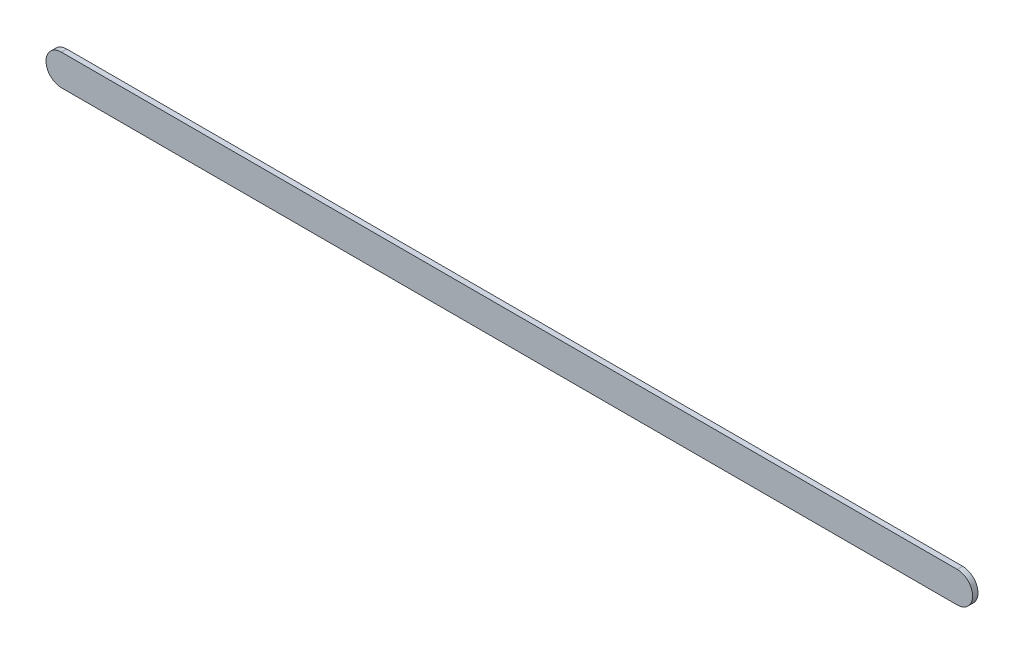
ISO-10303-21;
HEADER;
FILE_DESCRIPTION(('STEP AP214'),'2;1');
FILE_NAME('part.step','',(''),(''),'','','');
FILE_SCHEMA(('AUTOMOTIVE_DESIGN { 1 0 10303 214 1 1 1 1 }'));
ENDSEC;
DATA;
#1=APPLICATION_CONTEXT('core data for automotive mechanical design processes');
#2=APPLICATION_PROTOCOL_DEFINITION('international standard','automotive_design',2000,#1);
#3=PRODUCT_CONTEXT('',#1,'mechanical');
#4=PRODUCT('Part','Part','',(#3));
#5=PRODUCT_RELATED_PRODUCT_CATEGORY('part','',(#4));
#6=PRODUCT_DEFINITION_FORMATION('','',#4);
#7=PRODUCT_DEFINITION_CONTEXT('part definition',#1,'design');
#8=PRODUCT_DEFINITION('design','',#6,#7);
#9=PRODUCT_DEFINITION_SHAPE('','',#8);
#10=(LENGTH_UNIT() NAMED_UNIT(*) SI_UNIT(.MILLI.,.METRE.));
#11=(NAMED_UNIT(*) PLANE_ANGLE_UNIT() SI_UNIT($,.RADIAN.));
#12=(NAMED_UNIT(*) SI_UNIT($,.STERADIAN.) SOLID_ANGLE_UNIT());
#13=UNCERTAINTY_MEASURE_WITH_UNIT(LENGTH_MEASURE(1.E-05),#10,'distance_accuracy_value','');
#14=(GEOMETRIC_REPRESENTATION_CONTEXT(3) GLOBAL_UNCERTAINTY_ASSIGNED_CONTEXT((#13)) GLOBAL_UNIT_ASSIGNED_CONTEXT((#10,
#11,#12)) REPRESENTATION_CONTEXT('',''));
#15=CARTESIAN_POINT('',(0.,0.,0.));
#16=DIRECTION('',(0.,0.,1.));
#17=DIRECTION('',(1.,0.,0.));
#18=AXIS2_PLACEMENT_3D('',#15,#16,#17);
#19=CARTESIAN_POINT('',(102.892893,-104.5,1.635));
#20=DIRECTION('',(0.,0.,1.));
#21=DIRECTION('',(1.,0.,0.));
#22=AXIS2_PLACEMENT_3D('',#19,#20,#21);
#23=PLANE('',#22);
#24=DIRECTION('',(1.,0.,0.));
#25=VECTOR('',#24,1.);
#26=CARTESIAN_POINT('',(102.892893,-104.5,1.635));
#27=LINE('',#26,#25);
#28=CARTESIAN_POINT('',(102.892893,-104.5,1.635));
#29=VERTEX_POINT('',#28);
#30=CARTESIAN_POINT('',(108.7,-104.5,1.635));
#31=VERTEX_POINT('',#30);
#32=EDGE_CURVE('E81',#29,#31,#27,.T.);
#33=ORIENTED_EDGE('',*,*,#32,.T.);
#34=CARTESIAN_POINT('',(108.7,-104.4,1.635));
#35=DIRECTION('',(0.,0.,1.));
#36=DIRECTION('',(1.42108547152E-13,-1.,0.));
#37=AXIS2_PLACEMENT_3D('',#34,#35,#36);
#38=CIRCLE('',#37,0.1);
#39=CARTESIAN_POINT('',(108.7,-104.3,1.635));
#40=VERTEX_POINT('',#39);
#41=EDGE_CURVE('E108',#31,#40,#38,.T.);
#42=ORIENTED_EDGE('',*,*,#41,.T.);
#43=DIRECTION('',(-1.,0.,0.));
#44=VECTOR('',#43,1.);
#45=CARTESIAN_POINT('',(108.7,-104.3,1.635));
#46=LINE('',#45,#44);
#47=CARTESIAN_POINT('',(102.892893,-104.3,1.635));
#48=VERTEX_POINT('',#47);
#49=EDGE_CURVE('E74',#40,#48,#46,.T.);
#50=ORIENTED_EDGE('',*,*,#49,.T.);
#51=CARTESIAN_POINT('',(102.892893,-104.4,1.635));
#52=DIRECTION('',(0.,0.,1.));
#53=DIRECTION('',(-1.42108547152E-13,1.,0.));
#54=AXIS2_PLACEMENT_3D('',#51,#52,#53);
#55=CIRCLE('',#54,0.1);
#56=EDGE_CURVE('E11',#48,#29,#55,.T.);
#57=ORIENTED_EDGE('',*,*,#56,.T.);
#58=EDGE_LOOP('',(#33,#42,#50,#57));
#59=FACE_BOUND('',#58,.T.);
#60=ADVANCED_FACE('F17',(#59),#23,.T.);
#61=CARTESIAN_POINT('',(102.892893,-104.5,1.6));
#62=DIRECTION('',(0.,0.,1.));
#63=DIRECTION('',(1.,0.,0.));
#64=AXIS2_PLACEMENT_3D('',#61,#62,#63);
#65=PLANE('',#64);
#66=CARTESIAN_POINT('',(102.892893,-104.4,1.6));
#67=DIRECTION('',(0.,0.,1.));
#68=DIRECTION('',(-1.42108547152E-13,1.,0.));
#69=AXIS2_PLACEMENT_3D('',#66,#67,#68);
#70=CIRCLE('',#69,0.1);
#71=CARTESIAN_POINT('',(102.892893,-104.3,1.6));
#72=VERTEX_POINT('',#71);
#73=CARTESIAN_POINT('',(102.892893,-104.5,1.6));
#74=VERTEX_POINT('',#73);
#75=EDGE_CURVE('E25',#72,#74,#70,.T.);
#76=ORIENTED_EDGE('',*,*,#75,.F.);
#77=DIRECTION('',(-1.,0.,0.));
#78=VECTOR('',#77,1.);
#79=CARTESIAN_POINT('',(108.7,-104.3,1.6));
#80=LINE('',#79,#78);
#81=CARTESIAN_POINT('',(108.7,-104.3,1.6));
#82=VERTEX_POINT('',#81);
#83=EDGE_CURVE('E99',#82,#72,#80,.T.);
#84=ORIENTED_EDGE('',*,*,#83,.F.);
#85=CARTESIAN_POINT('',(108.7,-104.4,1.6));
#86=DIRECTION('',(0.,0.,1.));
#87=DIRECTION('',(1.42108547152E-13,-1.,0.));
#88=AXIS2_PLACEMENT_3D('',#85,#86,#87);
#89=CIRCLE('',#88,0.1);
#90=CARTESIAN_POINT('',(108.7,-104.5,1.6));
#91=VERTEX_POINT('',#90);
#92=EDGE_CURVE('E83',#91,#82,#89,.T.);
#93=ORIENTED_EDGE('',*,*,#92,.F.);
#94=DIRECTION('',(1.,0.,0.));
#95=VECTOR('',#94,1.);
#96=CARTESIAN_POINT('',(102.892893,-104.5,1.6));
#97=LINE('',#96,#95);
#98=EDGE_CURVE('E79',#74,#91,#97,.T.);
#99=ORIENTED_EDGE('',*,*,#98,.F.);
#100=EDGE_LOOP('',(#76,#84,#93,#99));
#101=FACE_BOUND('',#100,.T.);
#102=ADVANCED_FACE('F85',(#101),#65,.F.);
#103=CARTESIAN_POINT('',(102.892893,-104.4,1.6));
#104=DIRECTION('',(0.,0.,-1.));
#105=DIRECTION('',(-1.42108547152E-13,1.,0.));
#106=AXIS2_PLACEMENT_3D('',#103,#104,#105);
#107=CYLINDRICAL_SURFACE('',#106,0.1);
#108=ORIENTED_EDGE('',*,*,#75,.T.);
#109=DIRECTION('',(0.,0.,1.));
#110=VECTOR('',#109,1.);
#111=CARTESIAN_POINT('',(102.892893,-104.5,1.6));
#112=LINE('',#111,#110);
#113=EDGE_CURVE('E68',#74,#29,#112,.T.);
#114=ORIENTED_EDGE('',*,*,#113,.T.);
#115=ORIENTED_EDGE('',*,*,#56,.F.);
#116=DIRECTION('',(0.,0.,1.));
#117=VECTOR('',#116,1.);
#118=CARTESIAN_POINT('',(102.892893,-104.3,1.6));
#119=LINE('',#118,#117);
#120=EDGE_CURVE('E71',#72,#48,#119,.T.);
#121=ORIENTED_EDGE('',*,*,#120,.F.);
#122=EDGE_LOOP('',(#108,#114,#115,#121));
#123=FACE_BOUND('',#122,.T.);
#124=ADVANCED_FACE('F67',(#123),#107,.T.);
#125=CARTESIAN_POINT('',(108.7,-104.3,1.6));
#126=DIRECTION('',(0.,-1.,0.));
#127=DIRECTION('',(0.,0.,-1.));
#128=AXIS2_PLACEMENT_3D('',#125,#126,#127);
#129=PLANE('',#128);
#130=ORIENTED_EDGE('',*,*,#83,.T.);
#131=ORIENTED_EDGE('',*,*,#120,.T.);
#132=ORIENTED_EDGE('',*,*,#49,.F.);
#133=DIRECTION('',(0.,0.,1.));
#134=VECTOR('',#133,1.);
#135=CARTESIAN_POINT('',(108.7,-104.3,1.6));
#136=LINE('',#135,#134);
#137=EDGE_CURVE('E104',#82,#40,#136,.T.);
#138=ORIENTED_EDGE('',*,*,#137,.F.);
#139=EDGE_LOOP('',(#130,#131,#132,#138));
#140=FACE_BOUND('',#139,.T.);
#141=ADVANCED_FACE('F120',(#140),#129,.F.);
#142=CARTESIAN_POINT('',(108.7,-104.4,1.6));
#143=DIRECTION('',(0.,0.,-1.));
#144=DIRECTION('',(1.42108547152E-13,-1.,0.));
#145=AXIS2_PLACEMENT_3D('',#142,#143,#144);
#146=CYLINDRICAL_SURFACE('',#145,0.1);
#147=ORIENTED_EDGE('',*,*,#92,.T.);
#148=ORIENTED_EDGE('',*,*,#137,.T.);
#149=ORIENTED_EDGE('',*,*,#41,.F.);
#150=DIRECTION('',(0.,0.,1.));
#151=VECTOR('',#150,1.);
#152=CARTESIAN_POINT('',(108.7,-104.5,1.6));
#153=LINE('',#152,#151);
#154=EDGE_CURVE('E89',#91,#31,#153,.T.);
#155=ORIENTED_EDGE('',*,*,#154,.F.);
#156=EDGE_LOOP('',(#147,#148,#149,#155));
#157=FACE_BOUND('',#156,.T.);
#158=ADVANCED_FACE('F122',(#157),#146,.T.);
#159=CARTESIAN_POINT('',(102.892893,-104.5,1.6));
#160=DIRECTION('',(0.,1.,0.));
#161=DIRECTION('',(1.,0.,0.));
#162=AXIS2_PLACEMENT_3D('',#159,#160,#161);
#163=PLANE('',#162);
#164=ORIENTED_EDGE('',*,*,#98,.T.);
#165=ORIENTED_EDGE('',*,*,#154,.T.);
#166=ORIENTED_EDGE('',*,*,#32,.F.);
#167=ORIENTED_EDGE('',*,*,#113,.F.);
#168=EDGE_LOOP('',(#164,#165,#166,#167));
#169=FACE_BOUND('',#168,.T.);
#170=ADVANCED_FACE('F77',(#169),#163,.F.);
#171=CLOSED_SHELL('',(#60,#102,#124,#141,#158,#170));
#172=MANIFOLD_SOLID_BREP('B1',#171);
#173=ADVANCED_BREP_SHAPE_REPRESENTATION('',(#18,#172),#14);
#174=SHAPE_DEFINITION_REPRESENTATION(#9,#173);
ENDSEC;
END-ISO-10303-21;
